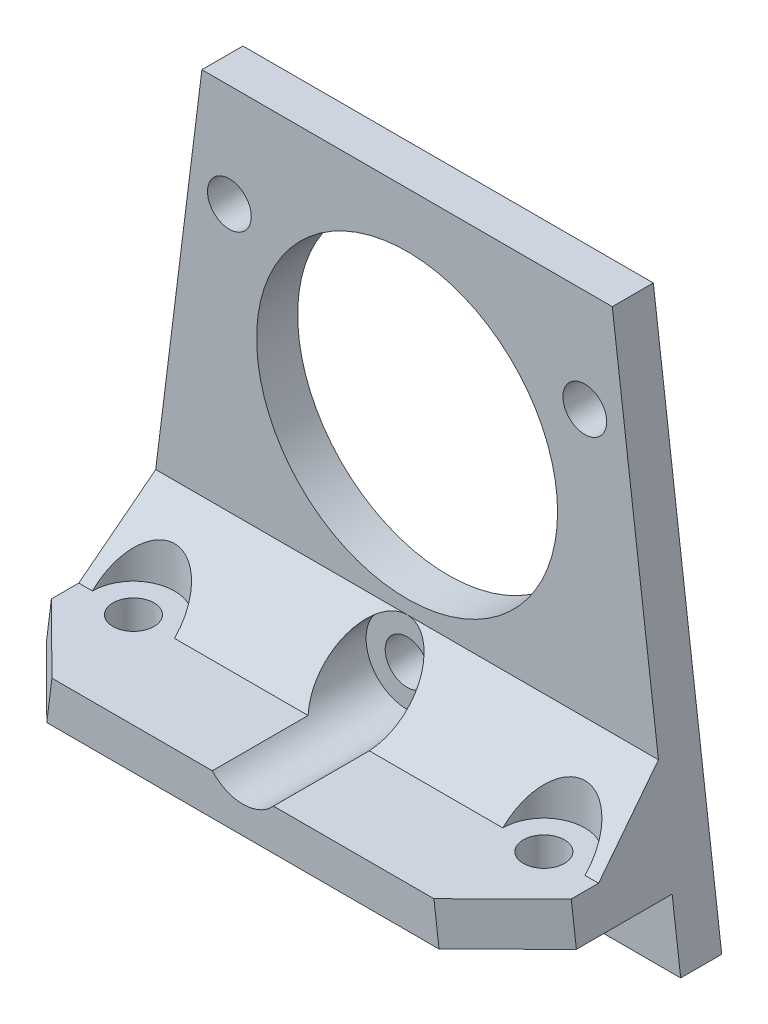
ISO-10303-21;
HEADER;
FILE_DESCRIPTION(('STEP AP214'),'2;1');
FILE_NAME('part.step','',(''),(''),'','','');
FILE_SCHEMA(('AUTOMOTIVE_DESIGN { 1 0 10303 214 1 1 1 1 }'));
ENDSEC;
DATA;
#1=APPLICATION_CONTEXT('core data for automotive mechanical design processes');
#2=APPLICATION_PROTOCOL_DEFINITION('international standard','automotive_design',2000,#1);
#3=PRODUCT_CONTEXT('',#1,'mechanical');
#4=PRODUCT('Part','Part','',(#3));
#5=PRODUCT_RELATED_PRODUCT_CATEGORY('part','',(#4));
#6=PRODUCT_DEFINITION_FORMATION('','',#4);
#7=PRODUCT_DEFINITION_CONTEXT('part definition',#1,'design');
#8=PRODUCT_DEFINITION('design','',#6,#7);
#9=PRODUCT_DEFINITION_SHAPE('','',#8);
#10=(LENGTH_UNIT() NAMED_UNIT(*) SI_UNIT(.MILLI.,.METRE.));
#11=(NAMED_UNIT(*) PLANE_ANGLE_UNIT() SI_UNIT($,.RADIAN.));
#12=(NAMED_UNIT(*) SI_UNIT($,.STERADIAN.) SOLID_ANGLE_UNIT());
#13=UNCERTAINTY_MEASURE_WITH_UNIT(LENGTH_MEASURE(1.E-05),#10,'distance_accuracy_value','');
#14=(GEOMETRIC_REPRESENTATION_CONTEXT(3) GLOBAL_UNCERTAINTY_ASSIGNED_CONTEXT((#13)) GLOBAL_UNIT_ASSIGNED_CONTEXT((#10,
#11,#12)) REPRESENTATION_CONTEXT('',''));
#15=CARTESIAN_POINT('',(0.,0.,0.));
#16=DIRECTION('',(0.,0.,1.));
#17=DIRECTION('',(1.,0.,0.));
#18=AXIS2_PLACEMENT_3D('',#15,#16,#17);
#19=CARTESIAN_POINT('',(-72.881062952465,-33.057616187095,8.));
#20=DIRECTION('',(0.,1.,0.));
#21=DIRECTION('',(0.,0.,1.));
#22=AXIS2_PLACEMENT_3D('',#19,#20,#21);
#23=CYLINDRICAL_SURFACE('',#22,1.5);
#24=CARTESIAN_POINT('',(-72.881062952465,-28.8149754999757,8.));
#25=DIRECTION('',(0.,1.,0.));
#26=DIRECTION('',(0.,0.,1.));
#27=AXIS2_PLACEMENT_3D('',#24,#25,#26);
#28=CIRCLE('',#27,1.5);
#29=CARTESIAN_POINT('',(-72.881062952465,-28.8149754999757,9.5));
#30=VERTEX_POINT('',#29);
#31=EDGE_CURVE('E339',#30,#30,#28,.F.);
#32=ORIENTED_EDGE('',*,*,#31,.T.);
#33=EDGE_LOOP('',(#32));
#34=FACE_BOUND('',#33,.T.);
#35=CARTESIAN_POINT('',(-72.881062952465,-25.8149754999757,8.));
#36=DIRECTION('',(0.,1.,0.));
#37=DIRECTION('',(0.,0.,1.));
#38=AXIS2_PLACEMENT_3D('',#35,#36,#37);
#39=CIRCLE('',#38,1.5);
#40=CARTESIAN_POINT('',(-72.881062952465,-25.8149754999757,9.5));
#41=VERTEX_POINT('',#40);
#42=EDGE_CURVE('E336',#41,#41,#39,.T.);
#43=ORIENTED_EDGE('',*,*,#42,.T.);
#44=EDGE_LOOP('',(#43));
#45=FACE_BOUND('',#44,.T.);
#46=ADVANCED_FACE('F135',(#34,#45),#23,.F.);
#47=CARTESIAN_POINT('',(0.,-25.8149754999757,8.00000000000003));
#48=DIRECTION('',(0.,0.707106781186551,0.707106781186544));
#49=DIRECTION('',(1.,0.,0.));
#50=AXIS2_PLACEMENT_3D('',#47,#48,#49);
#51=PLANE('',#50);
#52=CARTESIAN_POINT('',(-72.881062952465,-25.8149755000545,8.));
#53=DIRECTION('',(0.,0.707106781186551,0.707106781186544));
#54=DIRECTION('',(0.,-0.707106781186544,0.707106781186551));
#55=AXIS2_PLACEMENT_3D('',#52,#53,#54);
#56=ELLIPSE('',#55,4.24264068711928,3.00000000000001);
#57=CARTESIAN_POINT('',(-75.881062952465,-25.8149754999757,8.00000000000003));
#58=VERTEX_POINT('',#57);
#59=CARTESIAN_POINT('',(-69.881062952465,-25.8149754999757,8.00000000000003));
#60=VERTEX_POINT('',#59);
#61=EDGE_CURVE('E244',#58,#60,#56,.F.);
#62=ORIENTED_EDGE('',*,*,#61,.T.);
#63=DIRECTION('',(-1.,0.,0.));
#64=VECTOR('',#63,1.);
#65=CARTESIAN_POINT('',(-76.881062952465,-25.8149754999757,8.00000000000003));
#66=LINE('',#65,#64);
#67=CARTESIAN_POINT('',(-60.1171309299648,-25.8149754999757,8.00000000000003));
#68=VERTEX_POINT('',#67);
#69=EDGE_CURVE('E260',#68,#60,#66,.T.);
#70=ORIENTED_EDGE('',*,*,#69,.F.);
#71=CARTESIAN_POINT('',(-57.881062952465,-23.8149754999757,6.00000000000001));
#72=DIRECTION('',(0.,0.707106781186551,0.707106781186544));
#73=DIRECTION('',(0.,0.707106781186544,-0.707106781186551));
#74=AXIS2_PLACEMENT_3D('',#71,#72,#73);
#75=ELLIPSE('',#74,4.24264068711931,3.);
#76=CARTESIAN_POINT('',(-57.881062952465,-20.8149754999757,3.));
#77=VERTEX_POINT('',#76);
#78=EDGE_CURVE('E12',#77,#68,#75,.T.);
#79=ORIENTED_EDGE('',*,*,#78,.F.);
#80=DIRECTION('',(1.,0.,0.));
#81=VECTOR('',#80,1.);
#82=CARTESIAN_POINT('',(-60.1171309299648,-20.8149754999757,3.));
#83=LINE('',#82,#81);
#84=CARTESIAN_POINT('',(-76.256062952465,-20.8149754999757,3.));
#85=VERTEX_POINT('',#84);
#86=EDGE_CURVE('E293',#85,#77,#83,.T.);
#87=ORIENTED_EDGE('',*,*,#86,.F.);
#88=DIRECTION('',(-0.0880450906325621,-0.704360725060496,0.704360725060502));
#89=VECTOR('',#88,1.);
#90=CARTESIAN_POINT('',(-76.2850857202754,-21.0471576424585,3.23218214248282));
#91=LINE('',#90,#89);
#92=CARTESIAN_POINT('',(-76.881062952465,-25.8149754999757,8.00000000000003));
#93=VERTEX_POINT('',#92);
#94=EDGE_CURVE('E143',#93,#85,#91,.F.);
#95=ORIENTED_EDGE('',*,*,#94,.F.);
#96=DIRECTION('',(-1.,0.,0.));
#97=VECTOR('',#96,1.);
#98=CARTESIAN_POINT('',(-76.881062952465,-25.8149754999757,8.00000000000003));
#99=LINE('',#98,#97);
#100=EDGE_CURVE('E257',#58,#93,#99,.T.);
#101=ORIENTED_EDGE('',*,*,#100,.F.);
#102=EDGE_LOOP('',(#62,#70,#79,#87,#95,#101));
#103=FACE_BOUND('',#102,.T.);
#104=ADVANCED_FACE('F137',(#103),#51,.T.);
#105=CARTESIAN_POINT('',(-42.881062952465,-33.057616187095,8.));
#106=DIRECTION('',(0.,1.,0.));
#107=DIRECTION('',(0.,0.,1.));
#108=AXIS2_PLACEMENT_3D('',#105,#106,#107);
#109=CYLINDRICAL_SURFACE('',#108,1.5);
#110=CARTESIAN_POINT('',(-42.881062952465,-28.8149754999757,8.));
#111=DIRECTION('',(0.,1.,0.));
#112=DIRECTION('',(0.,0.,1.));
#113=AXIS2_PLACEMENT_3D('',#110,#111,#112);
#114=CIRCLE('',#113,1.5);
#115=CARTESIAN_POINT('',(-42.881062952465,-28.8149754999757,9.50000000000001));
#116=VERTEX_POINT('',#115);
#117=EDGE_CURVE('E333',#116,#116,#114,.F.);
#118=ORIENTED_EDGE('',*,*,#117,.T.);
#119=EDGE_LOOP('',(#118));
#120=FACE_BOUND('',#119,.T.);
#121=CARTESIAN_POINT('',(-42.881062952465,-25.8149754999757,8.));
#122=DIRECTION('',(0.,1.,0.));
#123=DIRECTION('',(0.,0.,1.));
#124=AXIS2_PLACEMENT_3D('',#121,#122,#123);
#125=CIRCLE('',#124,1.5);
#126=CARTESIAN_POINT('',(-42.881062952465,-25.8149754999757,9.50000000000001));
#127=VERTEX_POINT('',#126);
#128=EDGE_CURVE('E326',#127,#127,#125,.T.);
#129=ORIENTED_EDGE('',*,*,#128,.T.);
#130=EDGE_LOOP('',(#129));
#131=FACE_BOUND('',#130,.T.);
#132=ADVANCED_FACE('F472',(#120,#131),#109,.F.);
#133=CARTESIAN_POINT('',(0.,-25.8149754999757,7.99999999999998));
#134=DIRECTION('',(0.,0.707106781186544,0.707106781186551));
#135=DIRECTION('',(1.,0.,0.));
#136=AXIS2_PLACEMENT_3D('',#133,#134,#135);
#137=PLANE('',#136);
#138=CARTESIAN_POINT('',(-42.881062952465,-25.8149754999977,8.));
#139=DIRECTION('',(0.,0.707106781186544,0.707106781186551));
#140=DIRECTION('',(0.,-0.707106781186551,0.707106781186544));
#141=AXIS2_PLACEMENT_3D('',#138,#139,#140);
#142=ELLIPSE('',#141,4.24264068711931,3.);
#143=CARTESIAN_POINT('',(-45.881062952465,-25.8149754999757,7.99999999999998));
#144=VERTEX_POINT('',#143);
#145=CARTESIAN_POINT('',(-39.881062952465,-25.8149754999757,7.99999999999998));
#146=VERTEX_POINT('',#145);
#147=EDGE_CURVE('E261',#144,#146,#142,.F.);
#148=ORIENTED_EDGE('',*,*,#147,.T.);
#149=DIRECTION('',(-1.,0.,0.));
#150=VECTOR('',#149,1.);
#151=CARTESIAN_POINT('',(-55.6449949749652,-25.8149754999757,7.99999999999998));
#152=LINE('',#151,#150);
#153=CARTESIAN_POINT('',(-38.881062952465,-25.8149754999757,7.99999999999998));
#154=VERTEX_POINT('',#153);
#155=EDGE_CURVE('E286',#154,#146,#152,.T.);
#156=ORIENTED_EDGE('',*,*,#155,.F.);
#157=DIRECTION('',(-0.0880450906325629,0.704360725060503,-0.704360725060496));
#158=VECTOR('',#157,1.);
#159=CARTESIAN_POINT('',(-40.4906655962428,-12.9381543497529,-4.87682115022266));
#160=LINE('',#159,#158);
#161=CARTESIAN_POINT('',(-39.506062952465,-20.8149754999757,3.));
#162=VERTEX_POINT('',#161);
#163=EDGE_CURVE('E298',#162,#154,#160,.F.);
#164=ORIENTED_EDGE('',*,*,#163,.F.);
#165=DIRECTION('',(1.,0.,0.));
#166=VECTOR('',#165,1.);
#167=CARTESIAN_POINT('',(-38.881062952465,-20.8149754999757,3.));
#168=LINE('',#167,#166);
#169=EDGE_CURVE('E156',#77,#162,#168,.T.);
#170=ORIENTED_EDGE('',*,*,#169,.F.);
#171=CARTESIAN_POINT('',(-57.881062952465,-23.8149754999757,6.));
#172=DIRECTION('',(0.,0.707106781186544,0.707106781186551));
#173=DIRECTION('',(0.,0.707106781186551,-0.707106781186544));
#174=AXIS2_PLACEMENT_3D('',#171,#172,#173);
#175=ELLIPSE('',#174,4.24264068711927,3.);
#176=CARTESIAN_POINT('',(-55.6449949749652,-25.8149754999757,7.99999999999998));
#177=VERTEX_POINT('',#176);
#178=EDGE_CURVE('E296',#177,#77,#175,.T.);
#179=ORIENTED_EDGE('',*,*,#178,.F.);
#180=DIRECTION('',(-1.,0.,0.));
#181=VECTOR('',#180,1.);
#182=CARTESIAN_POINT('',(-55.6449949749652,-25.8149754999757,7.99999999999998));
#183=LINE('',#182,#181);
#184=EDGE_CURVE('E284',#144,#177,#183,.T.);
#185=ORIENTED_EDGE('',*,*,#184,.F.);
#186=EDGE_LOOP('',(#148,#156,#164,#170,#179,#185));
#187=FACE_BOUND('',#186,.T.);
#188=ADVANCED_FACE('F446',(#187),#137,.T.);
#189=CARTESIAN_POINT('',(0.,0.,3.));
#190=DIRECTION('',(0.,0.,1.));
#191=DIRECTION('',(1.,0.,0.));
#192=AXIS2_PLACEMENT_3D('',#189,#190,#191);
#193=PLANE('',#192);
#194=CARTESIAN_POINT('',(-57.881062952465,-23.8149754999757,3.));
#195=DIRECTION('',(0.,0.,1.));
#196=DIRECTION('',(1.,0.,0.));
#197=AXIS2_PLACEMENT_3D('',#194,#195,#196);
#198=CIRCLE('',#197,1.6);
#199=CARTESIAN_POINT('',(-56.281062952465,-23.8149754999757,3.));
#200=VERTEX_POINT('',#199);
#201=EDGE_CURVE('E379',#200,#200,#198,.T.);
#202=ORIENTED_EDGE('',*,*,#201,.F.);
#203=EDGE_LOOP('',(#202));
#204=FACE_BOUND('',#203,.T.);
#205=CARTESIAN_POINT('',(-57.881062952465,-23.8149754999757,3.));
#206=DIRECTION('',(0.,0.,1.));
#207=DIRECTION('',(1.,0.,0.));
#208=AXIS2_PLACEMENT_3D('',#205,#206,#207);
#209=CIRCLE('',#208,3.);
#210=EDGE_CURVE('E149',#77,#77,#209,.T.);
#211=ORIENTED_EDGE('',*,*,#210,.T.);
#212=EDGE_LOOP('',(#211));
#213=FACE_BOUND('',#212,.T.);
#214=ADVANCED_FACE('F485',(#204,#213),#193,.T.);
#215=CARTESIAN_POINT('',(0.,-25.8149754999757,15.));
#216=DIRECTION('',(0.,1.,0.));
#217=DIRECTION('',(0.,0.,1.));
#218=AXIS2_PLACEMENT_3D('',#215,#216,#217);
#219=PLANE('',#218);
#220=CARTESIAN_POINT('',(-42.881062952465,-25.8149754999757,8.));
#221=DIRECTION('',(0.,1.,0.));
#222=DIRECTION('',(0.,0.,1.));
#223=AXIS2_PLACEMENT_3D('',#220,#221,#222);
#224=CIRCLE('',#223,3.);
#225=EDGE_CURVE('E746',#146,#144,#224,.T.);
#226=ORIENTED_EDGE('',*,*,#225,.T.);
#227=ORIENTED_EDGE('',*,*,#184,.T.);
#228=DIRECTION('',(0.,0.,-1.));
#229=VECTOR('',#228,1.);
#230=CARTESIAN_POINT('',(-55.6449949749652,-25.8149754999757,23.4852813742386));
#231=LINE('',#230,#229);
#232=CARTESIAN_POINT('',(-55.6449949749652,-25.8149754999757,15.));
#233=VERTEX_POINT('',#232);
#234=EDGE_CURVE('E323',#177,#233,#231,.F.);
#235=ORIENTED_EDGE('',*,*,#234,.T.);
#236=DIRECTION('',(1.,0.,0.));
#237=VECTOR('',#236,1.);
#238=CARTESIAN_POINT('',(0.,-25.8149754999757,15.));
#239=LINE('',#238,#237);
#240=CARTESIAN_POINT('',(-43.9199740451516,-25.8149754999757,15.));
#241=VERTEX_POINT('',#240);
#242=EDGE_CURVE('E342',#233,#241,#239,.T.);
#243=ORIENTED_EDGE('',*,*,#242,.T.);
#244=DIRECTION('',(0.709842214152023,0.,-0.7043607250605));
#245=VECTOR('',#244,1.);
#246=CARTESIAN_POINT('',(-21.7897545650365,-25.8149754999757,-6.95932719693609));
#247=LINE('',#246,#245);
#248=CARTESIAN_POINT('',(-38.881062952465,-25.8149754999757,9.99999999999999));
#249=VERTEX_POINT('',#248);
#250=EDGE_CURVE('E289',#241,#249,#247,.T.);
#251=ORIENTED_EDGE('',*,*,#250,.T.);
#252=DIRECTION('',(0.,0.,-1.));
#253=VECTOR('',#252,1.);
#254=CARTESIAN_POINT('',(-38.881062952465,-25.8149754999757,15.));
#255=LINE('',#254,#253);
#256=EDGE_CURVE('E347',#249,#154,#255,.T.);
#257=ORIENTED_EDGE('',*,*,#256,.T.);
#258=ORIENTED_EDGE('',*,*,#155,.T.);
#259=EDGE_LOOP('',(#226,#227,#235,#243,#251,#257,#258));
#260=FACE_BOUND('',#259,.T.);
#261=ORIENTED_EDGE('',*,*,#128,.F.);
#262=EDGE_LOOP('',(#261));
#263=FACE_BOUND('',#262,.T.);
#264=ADVANCED_FACE('F451',(#260,#263),#219,.T.);
#265=CARTESIAN_POINT('',(-72.881062952465,-25.8149754999757,8.));
#266=DIRECTION('',(0.,1.,0.));
#267=DIRECTION('',(0.,0.,1.));
#268=AXIS2_PLACEMENT_3D('',#265,#266,#267);
#269=CIRCLE('',#268,3.00000000000001);
#270=EDGE_CURVE('E247',#60,#58,#269,.T.);
#271=ORIENTED_EDGE('',*,*,#270,.T.);
#272=ORIENTED_EDGE('',*,*,#100,.T.);
#273=DIRECTION('',(0.,0.,-1.));
#274=VECTOR('',#273,1.);
#275=CARTESIAN_POINT('',(-76.881062952465,-25.8149754999757,15.));
#276=LINE('',#275,#274);
#277=CARTESIAN_POINT('',(-76.881062952465,-25.8149754999757,10.));
#278=VERTEX_POINT('',#277);
#279=EDGE_CURVE('E306',#278,#93,#276,.T.);
#280=ORIENTED_EDGE('',*,*,#279,.F.);
#281=DIRECTION('',(-0.709842214152025,0.,-0.704360725060498));
#282=VECTOR('',#281,1.);
#283=CARTESIAN_POINT('',(-35.6426179769443,-25.8149754999757,50.9199966192831));
#284=LINE('',#283,#282);
#285=CARTESIAN_POINT('',(-71.8421518597784,-25.8149754999757,15.));
#286=VERTEX_POINT('',#285);
#287=EDGE_CURVE('E267',#278,#286,#284,.F.);
#288=ORIENTED_EDGE('',*,*,#287,.T.);
#289=CARTESIAN_POINT('',(-60.1171309299648,-25.8149754999757,15.));
#290=VERTEX_POINT('',#289);
#291=EDGE_CURVE('E322',#286,#290,#239,.T.);
#292=ORIENTED_EDGE('',*,*,#291,.T.);
#293=DIRECTION('',(0.,0.,-1.));
#294=VECTOR('',#293,1.);
#295=CARTESIAN_POINT('',(-60.1171309299648,-25.8149754999757,23.4852813742386));
#296=LINE('',#295,#294);
#297=EDGE_CURVE('E319',#290,#68,#296,.T.);
#298=ORIENTED_EDGE('',*,*,#297,.T.);
#299=ORIENTED_EDGE('',*,*,#69,.T.);
#300=EDGE_LOOP('',(#271,#272,#280,#288,#292,#298,#299));
#301=FACE_BOUND('',#300,.T.);
#302=ORIENTED_EDGE('',*,*,#42,.F.);
#303=EDGE_LOOP('',(#302));
#304=FACE_BOUND('',#303,.T.);
#305=ADVANCED_FACE('F254',(#301,#304),#219,.T.);
#306=DIRECTION('',(-0.124034734589209,0.992277876713668,0.));
#307=VECTOR('',#306,1.);
#308=CARTESIAN_POINT('',(-41.4601205070395,-5.18251506337994,3.));
#309=LINE('',#308,#307);
#310=CARTESIAN_POINT('',(-37.881062952465,-33.8149754999757,3.));
#311=VERTEX_POINT('',#310);
#312=CARTESIAN_POINT('',(-38.506062952465,-28.8149754999757,3.));
#313=VERTEX_POINT('',#312);
#314=EDGE_CURVE('E395',#311,#313,#309,.T.);
#315=ORIENTED_EDGE('',*,*,#314,.T.);
#316=DIRECTION('',(-1.,0.,0.));
#317=VECTOR('',#316,1.);
#318=CARTESIAN_POINT('',(0.,-28.8149754999757,3.));
#319=LINE('',#318,#317);
#320=CARTESIAN_POINT('',(-77.256062952465,-28.8149754999757,3.));
#321=VERTEX_POINT('',#320);
#322=EDGE_CURVE('E355',#313,#321,#319,.T.);
#323=ORIENTED_EDGE('',*,*,#322,.T.);
#324=DIRECTION('',(0.124034734589209,0.992277876713668,0.));
#325=VECTOR('',#324,1.);
#326=CARTESIAN_POINT('',(-72.5210496147377,9.06513120184222,3.));
#327=LINE('',#326,#325);
#328=CARTESIAN_POINT('',(-77.881062952465,-33.8149754999757,3.));
#329=VERTEX_POINT('',#328);
#330=EDGE_CURVE('E312',#329,#321,#327,.T.);
#331=ORIENTED_EDGE('',*,*,#330,.F.);
#332=DIRECTION('',(-1.,0.,0.));
#333=VECTOR('',#332,1.);
#334=CARTESIAN_POINT('',(0.,-33.8149754999757,3.));
#335=LINE('',#334,#333);
#336=EDGE_CURVE('E384',#311,#329,#335,.T.);
#337=ORIENTED_EDGE('',*,*,#336,.F.);
#338=EDGE_LOOP('',(#315,#323,#331,#337));
#339=FACE_BOUND('',#338,.T.);
#340=ADVANCED_FACE('F424',(#339),#193,.T.);
#341=CARTESIAN_POINT('',(0.,-33.8149754999757,3.));
#342=DIRECTION('',(0.,-1.,0.));
#343=DIRECTION('',(0.,0.,-1.));
#344=AXIS2_PLACEMENT_3D('',#341,#342,#343);
#345=PLANE('',#344);
#346=DIRECTION('',(-1.,0.,0.));
#347=VECTOR('',#346,1.);
#348=CARTESIAN_POINT('',(0.,-33.8149754999757,0.));
#349=LINE('',#348,#347);
#350=CARTESIAN_POINT('',(-37.881062952465,-33.8149754999757,0.));
#351=VERTEX_POINT('',#350);
#352=CARTESIAN_POINT('',(-77.881062952465,-33.8149754999757,0.));
#353=VERTEX_POINT('',#352);
#354=EDGE_CURVE('E313',#351,#353,#349,.T.);
#355=ORIENTED_EDGE('',*,*,#354,.F.);
#356=DIRECTION('',(0.,0.,-1.));
#357=VECTOR('',#356,1.);
#358=CARTESIAN_POINT('',(-37.881062952465,-33.8149754999757,3.));
#359=LINE('',#358,#357);
#360=EDGE_CURVE('E390',#311,#351,#359,.T.);
#361=ORIENTED_EDGE('',*,*,#360,.F.);
#362=ORIENTED_EDGE('',*,*,#336,.T.);
#363=DIRECTION('',(0.,0.,-1.));
#364=VECTOR('',#363,1.);
#365=CARTESIAN_POINT('',(-77.881062952465,-33.8149754999757,3.));
#366=LINE('',#365,#364);
#367=EDGE_CURVE('E270',#329,#353,#366,.T.);
#368=ORIENTED_EDGE('',*,*,#367,.T.);
#369=EDGE_LOOP('',(#355,#361,#362,#368));
#370=FACE_BOUND('',#369,.T.);
#371=ADVANCED_FACE('F415',(#370),#345,.T.);
#372=CARTESIAN_POINT('',(-72.5210496147377,9.06513120184222,3.));
#373=DIRECTION('',(-0.992277876713668,0.124034734589209,0.));
#374=DIRECTION('',(-0.124034734589209,-0.992277876713668,0.));
#375=AXIS2_PLACEMENT_3D('',#372,#373,#374);
#376=PLANE('',#375);
#377=DIRECTION('',(0.,0.,-1.));
#378=VECTOR('',#377,1.);
#379=CARTESIAN_POINT('',(-77.256062952465,-28.8149754999757,15.));
#380=LINE('',#379,#378);
#381=CARTESIAN_POINT('',(-77.256062952465,-28.8149754999757,10.));
#382=VERTEX_POINT('',#381);
#383=EDGE_CURVE('E352',#382,#321,#380,.T.);
#384=ORIENTED_EDGE('',*,*,#383,.F.);
#385=DIRECTION('',(0.124034734589209,0.992277876713668,0.));
#386=VECTOR('',#385,1.);
#387=CARTESIAN_POINT('',(-72.5210496147377,9.06513120184222,10.));
#388=LINE('',#387,#386);
#389=EDGE_CURVE('E265',#382,#278,#388,.T.);
#390=ORIENTED_EDGE('',*,*,#389,.T.);
#391=ORIENTED_EDGE('',*,*,#279,.T.);
#392=ORIENTED_EDGE('',*,*,#94,.T.);
#393=CARTESIAN_POINT('',(-72.881062952465,6.18502450002429,3.));
#394=VERTEX_POINT('',#393);
#395=EDGE_CURVE('E304',#85,#394,#327,.T.);
#396=ORIENTED_EDGE('',*,*,#395,.T.);
#397=DIRECTION('',(0.,0.,-1.));
#398=VECTOR('',#397,1.);
#399=CARTESIAN_POINT('',(-72.881062952465,6.18502450002429,3.));
#400=LINE('',#399,#398);
#401=CARTESIAN_POINT('',(-72.881062952465,6.18502450002429,0.));
#402=VERTEX_POINT('',#401);
#403=EDGE_CURVE('E387',#394,#402,#400,.T.);
#404=ORIENTED_EDGE('',*,*,#403,.T.);
#405=DIRECTION('',(0.124034734589209,0.992277876713668,0.));
#406=VECTOR('',#405,1.);
#407=CARTESIAN_POINT('',(-72.5210496147377,9.06513120184222,0.));
#408=LINE('',#407,#406);
#409=EDGE_CURVE('E388',#353,#402,#408,.T.);
#410=ORIENTED_EDGE('',*,*,#409,.F.);
#411=ORIENTED_EDGE('',*,*,#367,.F.);
#412=ORIENTED_EDGE('',*,*,#330,.T.);
#413=EDGE_LOOP('',(#384,#390,#391,#392,#396,#404,#410,#411,#412));
#414=FACE_BOUND('',#413,.T.);
#415=ADVANCED_FACE('F302',(#414),#376,.T.);
#416=CARTESIAN_POINT('',(0.,0.,0.));
#417=DIRECTION('',(0.,0.,1.));
#418=DIRECTION('',(1.,0.,0.));
#419=AXIS2_PLACEMENT_3D('',#416,#417,#418);
#420=PLANE('',#419);
#421=CARTESIAN_POINT('',(-44.8906818956985,-1.31497549997563,0.));
#422=DIRECTION('',(0.,0.,1.));
#423=DIRECTION('',(1.,0.,0.));
#424=AXIS2_PLACEMENT_3D('',#421,#422,#423);
#425=CIRCLE('',#424,1.6);
#426=CARTESIAN_POINT('',(-43.2906818956985,-1.31497549997563,0.));
#427=VERTEX_POINT('',#426);
#428=EDGE_CURVE('E363',#427,#427,#425,.T.);
#429=ORIENTED_EDGE('',*,*,#428,.T.);
#430=EDGE_LOOP('',(#429));
#431=FACE_BOUND('',#430,.T.);
#432=CARTESIAN_POINT('',(-70.8714440092316,-1.31497549997575,0.));
#433=DIRECTION('',(0.,0.,1.));
#434=DIRECTION('',(1.,0.,0.));
#435=AXIS2_PLACEMENT_3D('',#432,#433,#434);
#436=CIRCLE('',#435,1.59999999999999);
#437=CARTESIAN_POINT('',(-69.2714440092316,-1.31497549997575,0.));
#438=VERTEX_POINT('',#437);
#439=EDGE_CURVE('E362',#438,#438,#436,.T.);
#440=ORIENTED_EDGE('',*,*,#439,.T.);
#441=EDGE_LOOP('',(#440));
#442=FACE_BOUND('',#441,.T.);
#443=CARTESIAN_POINT('',(-57.881062952465,-8.81497549997571,0.));
#444=DIRECTION('',(0.,0.,1.));
#445=DIRECTION('',(1.,0.,0.));
#446=AXIS2_PLACEMENT_3D('',#443,#444,#445);
#447=CIRCLE('',#446,11.);
#448=CARTESIAN_POINT('',(-46.881062952465,-8.81497549997571,0.));
#449=VERTEX_POINT('',#448);
#450=EDGE_CURVE('E373',#449,#449,#447,.T.);
#451=ORIENTED_EDGE('',*,*,#450,.T.);
#452=EDGE_LOOP('',(#451));
#453=FACE_BOUND('',#452,.T.);
#454=CARTESIAN_POINT('',(-57.881062952465,-23.8149754999757,0.));
#455=DIRECTION('',(0.,0.,1.));
#456=DIRECTION('',(1.,0.,0.));
#457=AXIS2_PLACEMENT_3D('',#454,#455,#456);
#458=CIRCLE('',#457,1.6);
#459=CARTESIAN_POINT('',(-56.281062952465,-23.8149754999757,0.));
#460=VERTEX_POINT('',#459);
#461=EDGE_CURVE('E376',#460,#460,#458,.T.);
#462=ORIENTED_EDGE('',*,*,#461,.T.);
#463=EDGE_LOOP('',(#462));
#464=FACE_BOUND('',#463,.T.);
#465=DIRECTION('',(1.,0.,0.));
#466=VECTOR('',#465,1.);
#467=CARTESIAN_POINT('',(0.,6.18502450002429,0.));
#468=LINE('',#467,#466);
#469=CARTESIAN_POINT('',(-42.881062952465,6.18502450002429,0.));
#470=VERTEX_POINT('',#469);
#471=EDGE_CURVE('E402',#402,#470,#468,.T.);
#472=ORIENTED_EDGE('',*,*,#471,.T.);
#473=DIRECTION('',(-0.124034734589209,0.992277876713668,0.));
#474=VECTOR('',#473,1.);
#475=CARTESIAN_POINT('',(-41.4601205070395,-5.18251506337994,0.));
#476=LINE('',#475,#474);
#477=EDGE_CURVE('E381',#351,#470,#476,.T.);
#478=ORIENTED_EDGE('',*,*,#477,.F.);
#479=ORIENTED_EDGE('',*,*,#354,.T.);
#480=ORIENTED_EDGE('',*,*,#409,.T.);
#481=EDGE_LOOP('',(#472,#478,#479,#480));
#482=FACE_BOUND('',#481,.T.);
#483=ADVANCED_FACE('F418',(#431,#442,#453,#464,#482),#420,.F.);
#484=ORIENTED_EDGE('',*,*,#86,.T.);
#485=ORIENTED_EDGE('',*,*,#169,.T.);
#486=CARTESIAN_POINT('',(-42.881062952465,6.18502450002429,3.));
#487=VERTEX_POINT('',#486);
#488=EDGE_CURVE('E398',#162,#487,#309,.T.);
#489=ORIENTED_EDGE('',*,*,#488,.T.);
#490=DIRECTION('',(1.,0.,0.));
#491=VECTOR('',#490,1.);
#492=CARTESIAN_POINT('',(0.,6.18502450002429,3.));
#493=LINE('',#492,#491);
#494=EDGE_CURVE('E310',#394,#487,#493,.T.);
#495=ORIENTED_EDGE('',*,*,#494,.F.);
#496=ORIENTED_EDGE('',*,*,#395,.F.);
#497=EDGE_LOOP('',(#484,#485,#489,#495,#496));
#498=FACE_BOUND('',#497,.T.);
#499=CARTESIAN_POINT('',(-44.8906818956985,-1.31497549997563,3.));
#500=DIRECTION('',(0.,0.,1.));
#501=DIRECTION('',(1.,0.,0.));
#502=AXIS2_PLACEMENT_3D('',#499,#500,#501);
#503=CIRCLE('',#502,1.6);
#504=CARTESIAN_POINT('',(-43.2906818956985,-1.31497549997563,3.));
#505=VERTEX_POINT('',#504);
#506=EDGE_CURVE('E358',#505,#505,#503,.T.);
#507=ORIENTED_EDGE('',*,*,#506,.F.);
#508=EDGE_LOOP('',(#507));
#509=FACE_BOUND('',#508,.T.);
#510=CARTESIAN_POINT('',(-70.8714440092316,-1.31497549997575,3.));
#511=DIRECTION('',(0.,0.,1.));
#512=DIRECTION('',(1.,0.,0.));
#513=AXIS2_PLACEMENT_3D('',#510,#511,#512);
#514=CIRCLE('',#513,1.59999999999999);
#515=CARTESIAN_POINT('',(-69.2714440092316,-1.31497549997575,3.));
#516=VERTEX_POINT('',#515);
#517=EDGE_CURVE('E359',#516,#516,#514,.T.);
#518=ORIENTED_EDGE('',*,*,#517,.F.);
#519=EDGE_LOOP('',(#518));
#520=FACE_BOUND('',#519,.T.);
#521=CARTESIAN_POINT('',(-57.881062952465,-8.81497549997571,3.));
#522=DIRECTION('',(0.,0.,1.));
#523=DIRECTION('',(1.,0.,0.));
#524=AXIS2_PLACEMENT_3D('',#521,#522,#523);
#525=CIRCLE('',#524,11.);
#526=CARTESIAN_POINT('',(-46.881062952465,-8.81497549997571,3.));
#527=VERTEX_POINT('',#526);
#528=EDGE_CURVE('E366',#527,#527,#525,.T.);
#529=ORIENTED_EDGE('',*,*,#528,.F.);
#530=EDGE_LOOP('',(#529));
#531=FACE_BOUND('',#530,.T.);
#532=ADVANCED_FACE('F307',(#498,#509,#520,#531),#193,.T.);
#533=CARTESIAN_POINT('',(-41.4601205070395,-5.18251506337994,3.));
#534=DIRECTION('',(-0.992277876713668,-0.124034734589209,0.));
#535=DIRECTION('',(0.124034734589209,-0.992277876713668,0.));
#536=AXIS2_PLACEMENT_3D('',#533,#534,#535);
#537=PLANE('',#536);
#538=ORIENTED_EDGE('',*,*,#256,.F.);
#539=DIRECTION('',(0.124034734589209,-0.992277876713668,0.));
#540=VECTOR('',#539,1.);
#541=CARTESIAN_POINT('',(-38.506062952465,-28.8149754999757,9.99999999999999));
#542=LINE('',#541,#540);
#543=CARTESIAN_POINT('',(-38.506062952465,-28.8149754999757,9.99999999999999));
#544=VERTEX_POINT('',#543);
#545=EDGE_CURVE('E291',#249,#544,#542,.T.);
#546=ORIENTED_EDGE('',*,*,#545,.T.);
#547=DIRECTION('',(0.,0.,-1.));
#548=VECTOR('',#547,1.);
#549=CARTESIAN_POINT('',(-38.506062952465,-28.8149754999757,15.));
#550=LINE('',#549,#548);
#551=EDGE_CURVE('E350',#544,#313,#550,.T.);
#552=ORIENTED_EDGE('',*,*,#551,.T.);
#553=ORIENTED_EDGE('',*,*,#314,.F.);
#554=ORIENTED_EDGE('',*,*,#360,.T.);
#555=ORIENTED_EDGE('',*,*,#477,.T.);
#556=DIRECTION('',(0.,0.,-1.));
#557=VECTOR('',#556,1.);
#558=CARTESIAN_POINT('',(-42.881062952465,6.18502450002429,3.));
#559=LINE('',#558,#557);
#560=EDGE_CURVE('E400',#487,#470,#559,.T.);
#561=ORIENTED_EDGE('',*,*,#560,.F.);
#562=ORIENTED_EDGE('',*,*,#488,.F.);
#563=ORIENTED_EDGE('',*,*,#163,.T.);
#564=EDGE_LOOP('',(#538,#546,#552,#553,#554,#555,#561,#562,#563));
#565=FACE_BOUND('',#564,.T.);
#566=ADVANCED_FACE('F411',(#565),#537,.F.);
#567=CARTESIAN_POINT('',(0.,6.18502450002429,3.));
#568=DIRECTION('',(0.,1.,0.));
#569=DIRECTION('',(0.,0.,1.));
#570=AXIS2_PLACEMENT_3D('',#567,#568,#569);
#571=PLANE('',#570);
#572=ORIENTED_EDGE('',*,*,#471,.F.);
#573=ORIENTED_EDGE('',*,*,#403,.F.);
#574=ORIENTED_EDGE('',*,*,#494,.T.);
#575=ORIENTED_EDGE('',*,*,#560,.T.);
#576=EDGE_LOOP('',(#572,#573,#574,#575));
#577=FACE_BOUND('',#576,.T.);
#578=ADVANCED_FACE('F421',(#577),#571,.T.);
#579=CARTESIAN_POINT('',(-57.881062952465,-23.8149754999757,34.1126983722081));
#580=DIRECTION('',(0.,0.,-1.));
#581=DIRECTION('',(-1.,0.,0.));
#582=AXIS2_PLACEMENT_3D('',#579,#580,#581);
#583=CYLINDRICAL_SURFACE('',#582,1.6);
#584=ORIENTED_EDGE('',*,*,#461,.F.);
#585=EDGE_LOOP('',(#584));
#586=FACE_BOUND('',#585,.T.);
#587=ORIENTED_EDGE('',*,*,#201,.T.);
#588=EDGE_LOOP('',(#587));
#589=FACE_BOUND('',#588,.T.);
#590=ADVANCED_FACE('F496',(#586,#589),#583,.F.);
#591=CARTESIAN_POINT('',(-57.881062952465,-8.81497549997571,34.1126983722081));
#592=DIRECTION('',(0.,0.,-1.));
#593=DIRECTION('',(-1.,0.,0.));
#594=AXIS2_PLACEMENT_3D('',#591,#592,#593);
#595=CYLINDRICAL_SURFACE('',#594,11.);
#596=ORIENTED_EDGE('',*,*,#450,.F.);
#597=EDGE_LOOP('',(#596));
#598=FACE_BOUND('',#597,.T.);
#599=ORIENTED_EDGE('',*,*,#528,.T.);
#600=EDGE_LOOP('',(#599));
#601=FACE_BOUND('',#600,.T.);
#602=ADVANCED_FACE('F489',(#598,#601),#595,.F.);
#603=CARTESIAN_POINT('',(-70.8714440092316,-1.31497549997575,34.1126983722081));
#604=DIRECTION('',(0.,0.,-1.));
#605=DIRECTION('',(-1.,0.,0.));
#606=AXIS2_PLACEMENT_3D('',#603,#604,#605);
#607=CYLINDRICAL_SURFACE('',#606,1.59999999999999);
#608=ORIENTED_EDGE('',*,*,#439,.F.);
#609=EDGE_LOOP('',(#608));
#610=FACE_BOUND('',#609,.T.);
#611=ORIENTED_EDGE('',*,*,#517,.T.);
#612=EDGE_LOOP('',(#611));
#613=FACE_BOUND('',#612,.T.);
#614=ADVANCED_FACE('F486',(#610,#613),#607,.F.);
#615=CARTESIAN_POINT('',(-44.8906818956985,-1.31497549997563,34.1126983722081));
#616=DIRECTION('',(0.,0.,-1.));
#617=DIRECTION('',(-1.,0.,0.));
#618=AXIS2_PLACEMENT_3D('',#615,#616,#617);
#619=CYLINDRICAL_SURFACE('',#618,1.6);
#620=ORIENTED_EDGE('',*,*,#428,.F.);
#621=EDGE_LOOP('',(#620));
#622=FACE_BOUND('',#621,.T.);
#623=ORIENTED_EDGE('',*,*,#506,.T.);
#624=EDGE_LOOP('',(#623));
#625=FACE_BOUND('',#624,.T.);
#626=ADVANCED_FACE('F481',(#622,#625),#619,.F.);
#627=CARTESIAN_POINT('',(0.,-28.8149754999757,15.));
#628=DIRECTION('',(0.,1.,0.));
#629=DIRECTION('',(0.,0.,1.));
#630=AXIS2_PLACEMENT_3D('',#627,#628,#629);
#631=PLANE('',#630);
#632=ORIENTED_EDGE('',*,*,#117,.F.);
#633=EDGE_LOOP('',(#632));
#634=FACE_BOUND('',#633,.T.);
#635=ORIENTED_EDGE('',*,*,#31,.F.);
#636=EDGE_LOOP('',(#635));
#637=FACE_BOUND('',#636,.T.);
#638=DIRECTION('',(1.,0.,0.));
#639=VECTOR('',#638,1.);
#640=CARTESIAN_POINT('',(0.,-28.8149754999757,15.));
#641=LINE('',#640,#639);
#642=CARTESIAN_POINT('',(-72.2171518597784,-28.8149754999757,15.));
#643=VERTEX_POINT('',#642);
#644=CARTESIAN_POINT('',(-43.5449740451516,-28.8149754999757,15.));
#645=VERTEX_POINT('',#644);
#646=EDGE_CURVE('E344',#643,#645,#641,.T.);
#647=ORIENTED_EDGE('',*,*,#646,.F.);
#648=DIRECTION('',(0.709842214152025,0.,0.704360725060498));
#649=VECTOR('',#648,1.);
#650=CARTESIAN_POINT('',(-74.8702035187265,-28.8149754999757,12.3674355330474));
#651=LINE('',#650,#649);
#652=EDGE_CURVE('E282',#643,#382,#651,.F.);
#653=ORIENTED_EDGE('',*,*,#652,.T.);
#654=ORIENTED_EDGE('',*,*,#383,.T.);
#655=ORIENTED_EDGE('',*,*,#322,.F.);
#656=ORIENTED_EDGE('',*,*,#551,.F.);
#657=DIRECTION('',(-0.709842214152023,0.,0.7043607250605));
#658=VECTOR('',#657,1.);
#659=CARTESIAN_POINT('',(-44.9943913316218,-28.8149754999757,16.4382247074907));
#660=LINE('',#659,#658);
#661=EDGE_CURVE('E280',#544,#645,#660,.T.);
#662=ORIENTED_EDGE('',*,*,#661,.T.);
#663=EDGE_LOOP('',(#647,#653,#654,#655,#656,#662));
#664=FACE_BOUND('',#663,.T.);
#665=ADVANCED_FACE('F429',(#634,#637,#664),#631,.F.);
#666=CARTESIAN_POINT('',(0.,0.,15.));
#667=DIRECTION('',(0.,0.,1.));
#668=DIRECTION('',(1.,0.,0.));
#669=AXIS2_PLACEMENT_3D('',#666,#667,#668);
#670=PLANE('',#669);
#671=ORIENTED_EDGE('',*,*,#291,.F.);
#672=DIRECTION('',(-0.124034734589209,-0.992277876713668,0.));
#673=VECTOR('',#672,1.);
#674=CARTESIAN_POINT('',(-67.5596602311694,8.44495752889618,15.));
#675=LINE('',#674,#673);
#676=EDGE_CURVE('E278',#286,#643,#675,.T.);
#677=ORIENTED_EDGE('',*,*,#676,.T.);
#678=ORIENTED_EDGE('',*,*,#646,.T.);
#679=DIRECTION('',(-0.124034734589209,0.992277876713668,0.));
#680=VECTOR('',#679,1.);
#681=CARTESIAN_POINT('',(-43.8424523360333,-26.4351491729218,15.));
#682=LINE('',#681,#680);
#683=EDGE_CURVE('E275',#645,#241,#682,.T.);
#684=ORIENTED_EDGE('',*,*,#683,.T.);
#685=ORIENTED_EDGE('',*,*,#242,.F.);
#686=CARTESIAN_POINT('',(-57.881062952465,-23.8149754999757,15.));
#687=DIRECTION('',(0.,0.,1.));
#688=DIRECTION('',(1.,0.,0.));
#689=AXIS2_PLACEMENT_3D('',#686,#687,#688);
#690=CIRCLE('',#689,3.);
#691=EDGE_CURVE('E324',#290,#233,#690,.T.);
#692=ORIENTED_EDGE('',*,*,#691,.F.);
#693=EDGE_LOOP('',(#671,#677,#678,#684,#685,#692));
#694=FACE_BOUND('',#693,.T.);
#695=ADVANCED_FACE('F437',(#694),#670,.T.);
#696=CARTESIAN_POINT('',(-57.881062952465,-23.8149754999757,23.4852813742386));
#697=DIRECTION('',(0.,0.,-1.));
#698=DIRECTION('',(-1.,0.,0.));
#699=AXIS2_PLACEMENT_3D('',#696,#697,#698);
#700=CYLINDRICAL_SURFACE('',#699,3.);
#701=ORIENTED_EDGE('',*,*,#210,.F.);
#702=ORIENTED_EDGE('',*,*,#78,.T.);
#703=ORIENTED_EDGE('',*,*,#297,.F.);
#704=ORIENTED_EDGE('',*,*,#691,.T.);
#705=ORIENTED_EDGE('',*,*,#234,.F.);
#706=ORIENTED_EDGE('',*,*,#178,.T.);
#707=EDGE_LOOP('',(#701,#702,#703,#704,#705,#706));
#708=FACE_BOUND('',#707,.T.);
#709=ADVANCED_FACE('F317',(#708),#700,.F.);
#710=CARTESIAN_POINT('',(-72.5210496147377,9.06513120184222,10.));
#711=DIRECTION('',(0.701646415445623,-0.0877058019307029,-0.707106781186548));
#712=DIRECTION('',(0.124034734589209,0.992277876713668,0.));
#713=AXIS2_PLACEMENT_3D('',#710,#711,#712);
#714=PLANE('',#713);
#715=ORIENTED_EDGE('',*,*,#652,.F.);
#716=ORIENTED_EDGE('',*,*,#676,.F.);
#717=ORIENTED_EDGE('',*,*,#287,.F.);
#718=ORIENTED_EDGE('',*,*,#389,.F.);
#719=EDGE_LOOP('',(#715,#716,#717,#718));
#720=FACE_BOUND('',#719,.T.);
#721=ADVANCED_FACE('F434',(#720),#714,.F.);
#722=CARTESIAN_POINT('',(-46.4215098906078,-5.80268873632598,15.));
#723=DIRECTION('',(0.701646415445624,0.0877058019307031,0.707106781186546));
#724=DIRECTION('',(0.124034734589209,-0.992277876713668,0.));
#725=AXIS2_PLACEMENT_3D('',#722,#723,#724);
#726=PLANE('',#725);
#727=ORIENTED_EDGE('',*,*,#661,.F.);
#728=ORIENTED_EDGE('',*,*,#545,.F.);
#729=ORIENTED_EDGE('',*,*,#250,.F.);
#730=ORIENTED_EDGE('',*,*,#683,.F.);
#731=EDGE_LOOP('',(#727,#728,#729,#730));
#732=FACE_BOUND('',#731,.T.);
#733=ADVANCED_FACE('F455',(#732),#726,.T.);
#734=CARTESIAN_POINT('',(-42.881062952465,500000.,8.));
#735=DIRECTION('',(0.,-1.,0.));
#736=DIRECTION('',(0.,0.,-1.));
#737=AXIS2_PLACEMENT_3D('',#734,#735,#736);
#738=CYLINDRICAL_SURFACE('',#737,3.);
#739=ORIENTED_EDGE('',*,*,#225,.F.);
#740=ORIENTED_EDGE('',*,*,#147,.F.);
#741=EDGE_LOOP('',(#739,#740));
#742=FACE_BOUND('',#741,.T.);
#743=ADVANCED_FACE('F457',(#742),#738,.F.);
#744=CARTESIAN_POINT('',(-72.881062952465,500000.,8.));
#745=DIRECTION('',(0.,-1.,0.));
#746=DIRECTION('',(0.,0.,-1.));
#747=AXIS2_PLACEMENT_3D('',#744,#745,#746);
#748=CYLINDRICAL_SURFACE('',#747,3.00000000000001);
#749=ORIENTED_EDGE('',*,*,#270,.F.);
#750=ORIENTED_EDGE('',*,*,#61,.F.);
#751=EDGE_LOOP('',(#749,#750));
#752=FACE_BOUND('',#751,.T.);
#753=ADVANCED_FACE('F246',(#752),#748,.F.);
#754=CLOSED_SHELL('',(#46,#104,#132,#188,#214,#264,#305,#340,#371,#415,#483,#532,#566,#578,#590,
#602,#614,#626,#665,#695,#709,#721,#733,#743,#753));
#755=MANIFOLD_SOLID_BREP('B2',#754);
#756=ADVANCED_BREP_SHAPE_REPRESENTATION('',(#18,#755),#14);
#757=SHAPE_DEFINITION_REPRESENTATION(#9,#756);
ENDSEC;
END-ISO-10303-21;
